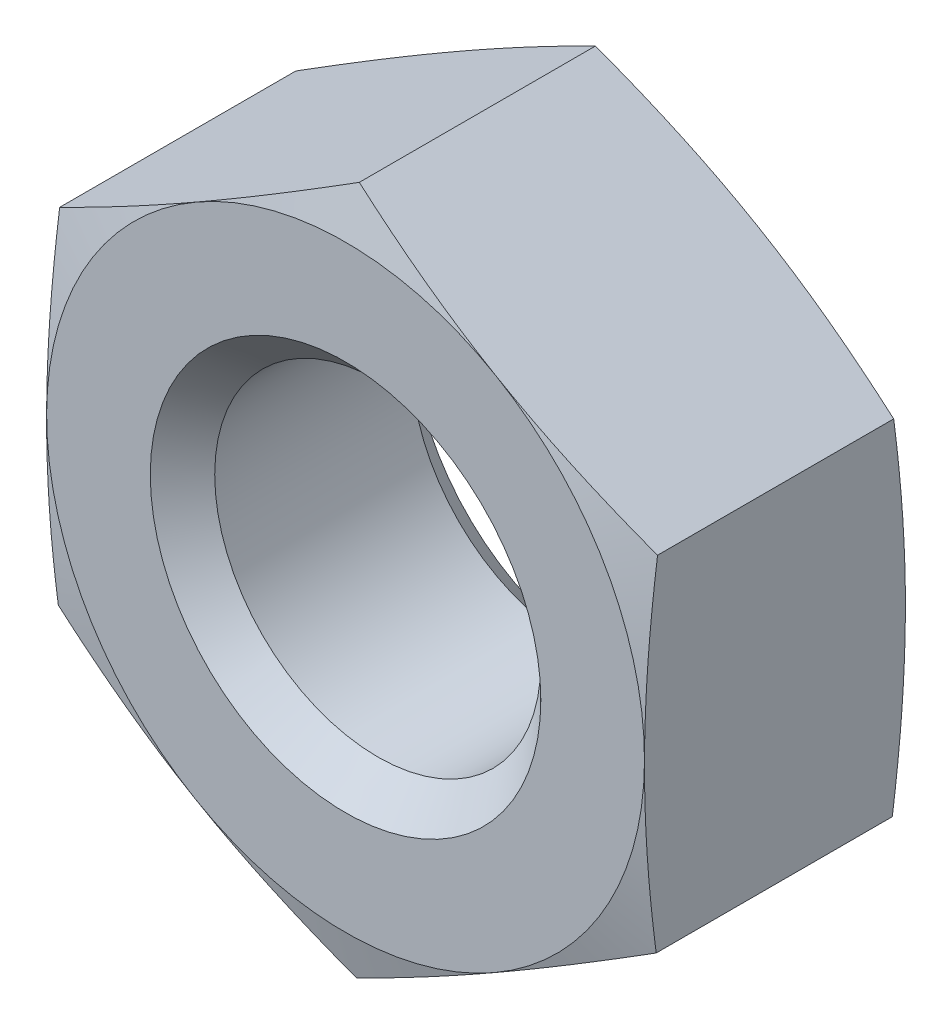
ISO-10303-21;
HEADER;
FILE_DESCRIPTION(('STEP AP214'),'2;1');
FILE_NAME('part.step','',(''),(''),'','','');
FILE_SCHEMA(('AUTOMOTIVE_DESIGN { 1 0 10303 214 1 1 1 1 }'));
ENDSEC;
DATA;
#1=APPLICATION_CONTEXT('core data for automotive mechanical design processes');
#2=APPLICATION_PROTOCOL_DEFINITION('international standard','automotive_design',2000,#1);
#3=PRODUCT_CONTEXT('',#1,'mechanical');
#4=PRODUCT('Part','Part','',(#3));
#5=PRODUCT_RELATED_PRODUCT_CATEGORY('part','',(#4));
#6=PRODUCT_DEFINITION_FORMATION('','',#4);
#7=PRODUCT_DEFINITION_CONTEXT('part definition',#1,'design');
#8=PRODUCT_DEFINITION('design','',#6,#7);
#9=PRODUCT_DEFINITION_SHAPE('','',#8);
#10=(LENGTH_UNIT() NAMED_UNIT(*) SI_UNIT(.MILLI.,.METRE.));
#11=(NAMED_UNIT(*) PLANE_ANGLE_UNIT() SI_UNIT($,.RADIAN.));
#12=(NAMED_UNIT(*) SI_UNIT($,.STERADIAN.) SOLID_ANGLE_UNIT());
#13=UNCERTAINTY_MEASURE_WITH_UNIT(LENGTH_MEASURE(1.E-05),#10,'distance_accuracy_value','');
#14=(GEOMETRIC_REPRESENTATION_CONTEXT(3) GLOBAL_UNCERTAINTY_ASSIGNED_CONTEXT((#13)) GLOBAL_UNIT_ASSIGNED_CONTEXT((#10,
#11,#12)) REPRESENTATION_CONTEXT('',''));
#15=CARTESIAN_POINT('',(0.,0.,0.));
#16=DIRECTION('',(0.,0.,1.));
#17=DIRECTION('',(1.,0.,0.));
#18=AXIS2_PLACEMENT_3D('',#15,#16,#17);
#19=CARTESIAN_POINT('',(2.75622420663921,1.57688346305915,2.4));
#20=DIRECTION('',(-0.503402758571263,-0.864051886557076,0.));
#21=DIRECTION('',(0.864051886557076,-0.503402758571263,0.));
#22=AXIS2_PLACEMENT_3D('',#19,#20,#21);
#23=PLANE('',#22);
#24=CARTESIAN_POINT('',(2.75642420663921,1.57676694164038,2.28597630562871));
#25=CARTESIAN_POINT('',(2.64246730397023,1.64315904152964,2.30365437862505));
#26=CARTESIAN_POINT('',(2.52830376483651,1.70967152928911,2.31970323754987));
#27=CARTESIAN_POINT('',(2.29957345240204,1.84293143189424,2.34789968129019));
#28=CARTESIAN_POINT('',(2.18500653432192,1.90967893108939,2.36004568099794));
#29=CARTESIAN_POINT('',(1.95616418569975,2.04300410677225,2.37972723842212));
#30=CARTESIAN_POINT('',(1.84189030306512,2.10958088143811,2.38728627052831));
#31=CARTESIAN_POINT('',(1.6131967873112,2.24281934603613,2.39742216920105));
#32=CARTESIAN_POINT('',(1.49877718669108,2.30948101703404,2.4));
#33=CARTESIAN_POINT('',(1.26993798545085,2.44280435902985,2.4));
#34=CARTESIAN_POINT('',(1.15551838483073,2.50946603002776,2.39742216920105));
#35=CARTESIAN_POINT('',(0.926824869076809,2.64270449462578,2.38728627052831));
#36=CARTESIAN_POINT('',(0.812550986442184,2.70928126929163,2.37972723842212));
#37=CARTESIAN_POINT('',(0.583708637820006,2.8426064449745,2.36004568099794));
#38=CARTESIAN_POINT('',(0.469141719739892,2.90935394416965,2.34789968129019));
#39=CARTESIAN_POINT('',(0.240411407305425,3.04261384677478,2.31970323754987));
#40=CARTESIAN_POINT('',(0.126247868171704,3.10912633453425,2.30365437862505));
#41=CARTESIAN_POINT('',(0.0122909655027258,3.17551843442351,2.28597630562871));
#42=B_SPLINE_CURVE_WITH_KNOTS('',3,(#24,#25,#26,#27,#28,#29,#30,#31,#32,#33,#34,#35,#36,#37,#38,
#39,#40,#41),.UNSPECIFIED.,.F.,.F.,(4,2,2,2,2,2,2,2,4),(0.,0.399219380024624,0.798600694727057,
1.19592049805513,1.59316338278475,1.99040626751437,2.38772607084244,2.78710738554488,
3.1863267655695),.UNSPECIFIED.);
#43=CARTESIAN_POINT('',(2.75622420663921,1.57688346305915,2.2860073180997));
#44=VERTEX_POINT('',#43);
#45=CARTESIAN_POINT('',(1.38435758607097,2.37614268803196,2.4));
#46=VERTEX_POINT('',#45);
#47=EDGE_CURVE('E74',#44,#46,#42,.T.);
#48=ORIENTED_EDGE('',*,*,#47,.F.);
#49=DIRECTION('',(0.,0.,-1.));
#50=VECTOR('',#49,1.);
#51=CARTESIAN_POINT('',(2.75622420663921,1.57688346305915,2.4));
#52=LINE('',#51,#50);
#53=CARTESIAN_POINT('',(2.75622420663921,1.57688346305915,0.113992681900295));
#54=VERTEX_POINT('',#53);
#55=EDGE_CURVE('E335',#44,#54,#52,.T.);
#56=ORIENTED_EDGE('',*,*,#55,.T.);
#57=CARTESIAN_POINT('',(0.0122909655027252,3.17551843442351,0.114023694371288));
#58=CARTESIAN_POINT('',(0.126247868171703,3.10912633453425,0.0963456213749529));
#59=CARTESIAN_POINT('',(0.240411407305425,3.04261384677478,0.0802967624501346));
#60=CARTESIAN_POINT('',(0.469141719739892,2.90935394416965,0.0521003187098057));
#61=CARTESIAN_POINT('',(0.583708637820006,2.8426064449745,0.0399543190020618));
#62=CARTESIAN_POINT('',(0.812550986442184,2.70928126929163,0.0202727615778808));
#63=CARTESIAN_POINT('',(0.926824869076809,2.64270449462578,0.0127137294716929));
#64=CARTESIAN_POINT('',(1.15551838483073,2.50946603002776,0.00257783079895237));
#65=CARTESIAN_POINT('',(1.26993798545085,2.44280435902985,0.));
#66=CARTESIAN_POINT('',(1.49877718669108,2.30948101703404,0.));
#67=CARTESIAN_POINT('',(1.6131967873112,2.24281934603613,0.00257783079895251));
#68=CARTESIAN_POINT('',(1.84189030306512,2.10958088143811,0.012713729471693));
#69=CARTESIAN_POINT('',(1.95616418569975,2.04300410677225,0.0202727615778809));
#70=CARTESIAN_POINT('',(2.18500653432192,1.90967893108939,0.0399543190020618));
#71=CARTESIAN_POINT('',(2.29957345240204,1.84293143189424,0.0521003187098058));
#72=CARTESIAN_POINT('',(2.52830376483651,1.70967152928911,0.0802967624501348));
#73=CARTESIAN_POINT('',(2.64246730397023,1.64315904152964,0.0963456213749532));
#74=CARTESIAN_POINT('',(2.75642420663921,1.57676694164038,0.114023694371289));
#75=B_SPLINE_CURVE_WITH_KNOTS('',3,(#57,#58,#59,#60,#61,#62,#63,#64,#65,#66,#67,#68,#69,#70,#71,
#72,#73,#74),.UNSPECIFIED.,.F.,.F.,(4,2,2,2,2,2,2,2,4),(0.,0.399219380024624,0.798600694727057,
1.19592049805513,1.59316338278475,1.99040626751437,2.38772607084244,2.78710738554488,
3.1863267655695),.UNSPECIFIED.);
#76=CARTESIAN_POINT('',(1.38435758607097,2.37614268803194,0.));
#77=VERTEX_POINT('',#76);
#78=EDGE_CURVE('E252',#77,#54,#75,.T.);
#79=ORIENTED_EDGE('',*,*,#78,.F.);
#80=CARTESIAN_POINT('',(0.0124909655027251,3.17540191300474,0.113992681900295));
#81=VERTEX_POINT('',#80);
#82=EDGE_CURVE('E261',#81,#77,#75,.T.);
#83=ORIENTED_EDGE('',*,*,#82,.F.);
#84=DIRECTION('',(0.,0.,-1.));
#85=VECTOR('',#84,1.);
#86=CARTESIAN_POINT('',(0.0124909655027252,3.17540191300474,2.4));
#87=LINE('',#86,#85);
#88=CARTESIAN_POINT('',(0.0124909655027252,3.17540191300474,2.2860073180997));
#89=VERTEX_POINT('',#88);
#90=EDGE_CURVE('E345',#89,#81,#87,.T.);
#91=ORIENTED_EDGE('',*,*,#90,.F.);
#92=EDGE_CURVE('E208',#46,#89,#42,.T.);
#93=ORIENTED_EDGE('',*,*,#92,.F.);
#94=EDGE_LOOP('',(#48,#56,#79,#83,#91,#93));
#95=FACE_BOUND('',#94,.T.);
#96=ADVANCED_FACE('F51',(#95),#23,.F.);
#97=CARTESIAN_POINT('',(0.0124909655027252,3.17540191300474,2.4));
#98=DIRECTION('',(0.496589504660666,-0.867985520536417,0.));
#99=DIRECTION('',(0.867985520536417,0.496589504660666,0.));
#100=AXIS2_PLACEMENT_3D('',#97,#98,#99);
#101=PLANE('',#100);
#102=CARTESIAN_POINT('',(0.0126909655027252,3.17551633645833,2.28597644618215));
#103=CARTESIAN_POINT('',(-0.101784655646926,3.1100228568352,2.30365449882257));
#104=CARTESIAN_POINT('',(-0.216467853699761,3.04441061888132,2.31970333863506));
#105=CARTESIAN_POINT('',(-0.446239319021437,2.91295439588035,2.34789974803124));
#106=CARTESIAN_POINT('',(-0.561327731728206,2.84711032762571,2.36004573251237));
#107=CARTESIAN_POINT('',(-0.791211743127703,2.71558971507018,2.37972726493454));
#108=CARTESIAN_POINT('',(-0.906005786870663,2.6499140603829,2.38728628721101));
#109=CARTESIAN_POINT('',(-1.13574028811269,2.51847898517019,2.39742217262927));
#110=CARTESIAN_POINT('',(-1.25068071296477,2.45271958332268,2.4));
#111=CARTESIAN_POINT('',(-1.48056156266891,2.32120077962765,2.4));
#112=CARTESIAN_POINT('',(-1.59550198752099,2.25544137778014,2.39742217262927));
#113=CARTESIAN_POINT('',(-1.82523648876302,2.12400630256743,2.38728628721101));
#114=CARTESIAN_POINT('',(-1.94003053250598,2.05833064788014,2.37972726493454));
#115=CARTESIAN_POINT('',(-2.16991454390547,1.92681003532461,2.36004573251237));
#116=CARTESIAN_POINT('',(-2.28500295661224,1.86096596706997,2.34789974803124));
#117=CARTESIAN_POINT('',(-2.51477442193392,1.72950974406901,2.31970333863506));
#118=CARTESIAN_POINT('',(-2.62945761998675,1.66389750611512,2.30365449882257));
#119=CARTESIAN_POINT('',(-2.74393324113641,1.59840402649199,2.28597644618215));
#120=B_SPLINE_CURVE_WITH_KNOTS('',3,(#102,#103,#104,#105,#106,#107,#108,#109,#110,#111,#112,
#113,#114,#115,#116,#117,#118,#119),.UNSPECIFIED.,.F.,.F.,(4,2,2,2,2,2,2,2,4),(0.,
0.399219113893778,0.798600161987334,1.19591970245069,1.59316232454533,1.99040494663998,
2.38772448710333,2.78710553519689,3.18632464909067),.UNSPECIFIED.);
#121=CARTESIAN_POINT('',(-1.36562113781683,2.38696018147515,2.4));
#122=VERTEX_POINT('',#121);
#123=EDGE_CURVE('E66',#89,#122,#120,.T.);
#124=ORIENTED_EDGE('',*,*,#123,.F.);
#125=ORIENTED_EDGE('',*,*,#90,.T.);
#126=CARTESIAN_POINT('',(-2.74393324113641,1.59840402649199,0.114023553817852));
#127=CARTESIAN_POINT('',(-2.62945761998676,1.66389750611512,0.0963455011774283));
#128=CARTESIAN_POINT('',(-2.51477442193392,1.72950974406901,0.0802966613649417));
#129=CARTESIAN_POINT('',(-2.28500295661224,1.86096596706997,0.0521002519687603));
#130=CARTESIAN_POINT('',(-2.16991454390547,1.92681003532461,0.0399542674876263));
#131=CARTESIAN_POINT('',(-1.94003053250598,2.05833064788014,0.0202727350654559));
#132=CARTESIAN_POINT('',(-1.82523648876302,2.12400630256743,0.0127137127889933));
#133=CARTESIAN_POINT('',(-1.59550198752099,2.25544137778014,0.00257782737072959));
#134=CARTESIAN_POINT('',(-1.48056156266891,2.32120077962765,0.));
#135=CARTESIAN_POINT('',(-1.25068071296477,2.45271958332268,0.));
#136=CARTESIAN_POINT('',(-1.1357402881127,2.51847898517019,0.00257782737072971));
#137=CARTESIAN_POINT('',(-0.906005786870663,2.6499140603829,0.0127137127889934));
#138=CARTESIAN_POINT('',(-0.791211743127704,2.71558971507018,0.0202727350654559));
#139=CARTESIAN_POINT('',(-0.561327731728206,2.84711032762571,0.0399542674876262));
#140=CARTESIAN_POINT('',(-0.446239319021438,2.91295439588035,0.0521002519687602));
#141=CARTESIAN_POINT('',(-0.216467853699761,3.04441061888132,0.0802966613649417));
#142=CARTESIAN_POINT('',(-0.101784655646926,3.1100228568352,0.0963455011774282));
#143=CARTESIAN_POINT('',(0.0126909655027246,3.17551633645833,0.114023553817852));
#144=B_SPLINE_CURVE_WITH_KNOTS('',3,(#126,#127,#128,#129,#130,#131,#132,#133,#134,#135,#136,
#137,#138,#139,#140,#141,#142,#143),.UNSPECIFIED.,.F.,.F.,(4,2,2,2,2,2,2,2,4),(0.,
0.399219113893778,0.798600161987333,1.19591970245069,1.59316232454533,1.99040494663998,
2.38772448710333,2.78710553519689,3.18632464909067),.UNSPECIFIED.);
#145=CARTESIAN_POINT('',(-1.36562113781684,2.38696018147516,0.));
#146=VERTEX_POINT('',#145);
#147=EDGE_CURVE('E380',#146,#81,#144,.T.);
#148=ORIENTED_EDGE('',*,*,#147,.F.);
#149=CARTESIAN_POINT('',(-2.74373324113641,1.59851844994559,0.113992681900295));
#150=VERTEX_POINT('',#149);
#151=EDGE_CURVE('E383',#150,#146,#144,.T.);
#152=ORIENTED_EDGE('',*,*,#151,.F.);
#153=DIRECTION('',(0.,0.,-1.));
#154=VECTOR('',#153,1.);
#155=CARTESIAN_POINT('',(-2.74373324113641,1.59851844994559,2.4));
#156=LINE('',#155,#154);
#157=CARTESIAN_POINT('',(-2.74373324113641,1.59851844994559,2.2860073180997));
#158=VERTEX_POINT('',#157);
#159=EDGE_CURVE('E343',#158,#150,#156,.T.);
#160=ORIENTED_EDGE('',*,*,#159,.F.);
#161=EDGE_CURVE('E147',#122,#158,#120,.T.);
#162=ORIENTED_EDGE('',*,*,#161,.F.);
#163=EDGE_LOOP('',(#124,#125,#148,#152,#160,#162));
#164=FACE_BOUND('',#163,.T.);
#165=ADVANCED_FACE('F270',(#164),#101,.F.);
#166=CARTESIAN_POINT('',(-2.74373324113641,1.59851844994559,2.4));
#167=DIRECTION('',(0.999992263231929,-0.00393363397934047,0.));
#168=DIRECTION('',(0.00393363397934047,0.99999226323193,0.));
#169=AXIS2_PLACEMENT_3D('',#166,#167,#168);
#170=PLANE('',#169);
#171=CARTESIAN_POINT('',(-2.74373245440352,1.59871844994559,2.28598052170744));
#172=CARTESIAN_POINT('',(-2.7442512379474,1.46683542958968,2.30365798410106));
#173=CARTESIAN_POINT('',(-2.74477096217433,1.33471327265422,2.31970626972659));
#174=CARTESIAN_POINT('',(-2.74581224627527,1.07000230812849,2.34790168327022));
#175=CARTESIAN_POINT('',(-2.74633380680831,0.937413333000125,2.36004722623671));
#176=CARTESIAN_POINT('',(-2.7473756009372,0.672572711264002,2.37972803369461));
#177=CARTESIAN_POINT('',(-2.74789582748676,0.540322855935874,2.38728677094625));
#178=CARTESIAN_POINT('',(-2.74893694408543,0.275654473147949,2.39742227203496));
#179=CARTESIAN_POINT('',(-2.74945783398661,0.143235983295568,2.4));
#180=CARTESIAN_POINT('',(-2.75049961378897,-0.121600996409194,2.4));
#181=CARTESIAN_POINT('',(-2.75102050369015,-0.254019486261576,2.39742227203496));
#182=CARTESIAN_POINT('',(-2.75206162028882,-0.5186878690495,2.38728677094625));
#183=CARTESIAN_POINT('',(-2.75258184683837,-0.650937724377628,2.37972803369461));
#184=CARTESIAN_POINT('',(-2.75362364096726,-0.915778346113751,2.36004722623671));
#185=CARTESIAN_POINT('',(-2.75414520150031,-1.04836732124212,2.34790168327023));
#186=CARTESIAN_POINT('',(-2.75518648560124,-1.31307828576785,2.31970626972659));
#187=CARTESIAN_POINT('',(-2.75570620982817,-1.4452004427033,2.30365798410106));
#188=CARTESIAN_POINT('',(-2.75622499337205,-1.57708346305921,2.28598052170744));
#189=B_SPLINE_CURVE_WITH_KNOTS('',3,(#171,#172,#173,#174,#175,#176,#177,#178,#179,#180,#181,
#182,#183,#184,#185,#186,#187,#188),.UNSPECIFIED.,.F.,.F.,(4,2,2,2,2,2,2,2,4),(0.,
0.39921139703684,0.798584714412668,1.19589663272394,1.59313163932816,1.99036664593238,
2.38767856424366,2.78705188161948,3.18626327865632),.UNSPECIFIED.);
#190=CARTESIAN_POINT('',(-2.74997872388781,0.0108174934431863,2.4));
#191=VERTEX_POINT('',#190);
#192=EDGE_CURVE('E140',#158,#191,#189,.T.);
#193=ORIENTED_EDGE('',*,*,#192,.F.);
#194=ORIENTED_EDGE('',*,*,#159,.T.);
#195=CARTESIAN_POINT('',(-2.75622499337205,-1.57708346305921,0.114019478292557));
#196=CARTESIAN_POINT('',(-2.75570620982817,-1.4452004427033,0.0963420158989422));
#197=CARTESIAN_POINT('',(-2.75518648560124,-1.31307828576785,0.0802937302734103));
#198=CARTESIAN_POINT('',(-2.75414520150031,-1.04836732124212,0.0520983167297749));
#199=CARTESIAN_POINT('',(-2.75362364096726,-0.915778346113751,0.039952773763288));
#200=CARTESIAN_POINT('',(-2.75258184683837,-0.650937724377628,0.0202719663053935));
#201=CARTESIAN_POINT('',(-2.75206162028882,-0.5186878690495,0.0127132290537472));
#202=CARTESIAN_POINT('',(-2.75102050369015,-0.254019486261576,0.00257772796504256));
#203=CARTESIAN_POINT('',(-2.75049961378897,-0.121600996409194,0.));
#204=CARTESIAN_POINT('',(-2.74945783398661,0.143235983295568,0.));
#205=CARTESIAN_POINT('',(-2.74893694408543,0.275654473147949,0.00257772796504258));
#206=CARTESIAN_POINT('',(-2.74789582748676,0.540322855935874,0.0127132290537473));
#207=CARTESIAN_POINT('',(-2.7473756009372,0.672572711264002,0.0202719663053936));
#208=CARTESIAN_POINT('',(-2.74633380680831,0.937413333000124,0.0399527737632882));
#209=CARTESIAN_POINT('',(-2.74581224627527,1.07000230812849,0.0520983167297751));
#210=CARTESIAN_POINT('',(-2.74477096217433,1.33471327265422,0.0802937302734104));
#211=CARTESIAN_POINT('',(-2.7442512379474,1.46683542958968,0.0963420158989423));
#212=CARTESIAN_POINT('',(-2.74373245440352,1.59871844994559,0.114019478292557));
#213=B_SPLINE_CURVE_WITH_KNOTS('',3,(#195,#196,#197,#198,#199,#200,#201,#202,#203,#204,#205,
#206,#207,#208,#209,#210,#211,#212),.UNSPECIFIED.,.F.,.F.,(4,2,2,2,2,2,2,2,4),(0.,
0.39921139703684,0.798584714412668,1.19589663272394,1.59313163932816,1.99036664593238,
2.38767856424366,2.78705188161948,3.18626327865632),.UNSPECIFIED.);
#214=CARTESIAN_POINT('',(-2.74997872388779,0.010817493443186,0.));
#215=VERTEX_POINT('',#214);
#216=EDGE_CURVE('E385',#215,#150,#213,.T.);
#217=ORIENTED_EDGE('',*,*,#216,.F.);
#218=CARTESIAN_POINT('',(-2.75622420663917,-1.57688346305921,0.113992681900294));
#219=VERTEX_POINT('',#218);
#220=EDGE_CURVE('E338',#219,#215,#213,.T.);
#221=ORIENTED_EDGE('',*,*,#220,.F.);
#222=DIRECTION('',(0.,0.,-1.));
#223=VECTOR('',#222,1.);
#224=CARTESIAN_POINT('',(-2.75622420663917,-1.57688346305921,2.4));
#225=LINE('',#224,#223);
#226=CARTESIAN_POINT('',(-2.75622420663917,-1.57688346305921,2.28600731809971));
#227=VERTEX_POINT('',#226);
#228=EDGE_CURVE('E174',#227,#219,#225,.T.);
#229=ORIENTED_EDGE('',*,*,#228,.F.);
#230=EDGE_CURVE('E151',#191,#227,#189,.T.);
#231=ORIENTED_EDGE('',*,*,#230,.F.);
#232=EDGE_LOOP('',(#193,#194,#217,#221,#229,#231));
#233=FACE_BOUND('',#232,.T.);
#234=ADVANCED_FACE('F172',(#233),#170,.F.);
#235=CARTESIAN_POINT('',(-2.75622420663917,-1.57688346305921,2.4));
#236=DIRECTION('',(0.503402758571253,0.864051886557082,0.));
#237=DIRECTION('',(-0.864051886557082,0.503402758571253,0.));
#238=AXIS2_PLACEMENT_3D('',#235,#236,#237);
#239=PLANE('',#238);
#240=CARTESIAN_POINT('',(-2.75642420663917,-1.57676694164044,2.28597630562871));
#241=CARTESIAN_POINT('',(-2.64246730397019,-1.6431590415297,2.30365437862505));
#242=CARTESIAN_POINT('',(-2.52830376483647,-1.70967152928917,2.31970323754986));
#243=CARTESIAN_POINT('',(-2.29957345240201,-1.84293143189429,2.34789968129019));
#244=CARTESIAN_POINT('',(-2.18500653432189,-1.90967893108944,2.36004568099794));
#245=CARTESIAN_POINT('',(-1.95616418569972,-2.0430041067723,2.37972723842212));
#246=CARTESIAN_POINT('',(-1.8418903030651,-2.10958088143815,2.3872862705283));
#247=CARTESIAN_POINT('',(-1.61319678731117,-2.24281934603617,2.39742216920104));
#248=CARTESIAN_POINT('',(-1.49877718669106,-2.30948101703407,2.4));
#249=CARTESIAN_POINT('',(-1.26993798545083,-2.44280435902988,2.4));
#250=CARTESIAN_POINT('',(-1.15551838483072,-2.50946603002778,2.39742216920104));
#251=CARTESIAN_POINT('',(-0.926824869076795,-2.6427044946258,2.3872862705283));
#252=CARTESIAN_POINT('',(-0.812550986442172,-2.70928126929165,2.37972723842211));
#253=CARTESIAN_POINT('',(-0.583708637819997,-2.84260644497451,2.36004568099793));
#254=CARTESIAN_POINT('',(-0.469141719739884,-2.90935394416966,2.34789968129019));
#255=CARTESIAN_POINT('',(-0.24041140730542,-3.04261384677479,2.31970323754986));
#256=CARTESIAN_POINT('',(-0.1262478681717,-3.10912633453425,2.30365437862505));
#257=CARTESIAN_POINT('',(-0.0122909655027241,-3.17551843442351,2.28597630562871));
#258=B_SPLINE_CURVE_WITH_KNOTS('',3,(#240,#241,#242,#243,#244,#245,#246,#247,#248,#249,#250,
#251,#252,#253,#254,#255,#256,#257),.UNSPECIFIED.,.F.,.F.,(4,2,2,2,2,2,2,2,4),(0.,
0.399219380024616,0.798600694727041,1.19592049805511,1.59316338278472,1.99040626751433,
2.3877260708424,2.78710738554482,3.18632676556944),.UNSPECIFIED.);
#259=CARTESIAN_POINT('',(-1.38435758607095,-2.37614268803198,2.4));
#260=VERTEX_POINT('',#259);
#261=EDGE_CURVE('E159',#227,#260,#258,.T.);
#262=ORIENTED_EDGE('',*,*,#261,.F.);
#263=ORIENTED_EDGE('',*,*,#228,.T.);
#264=CARTESIAN_POINT('',(-0.012290965502724,-3.17551843442351,0.114023694371289));
#265=CARTESIAN_POINT('',(-0.1262478681717,-3.10912633453425,0.0963456213749538));
#266=CARTESIAN_POINT('',(-0.24041140730542,-3.04261384677479,0.080296762450136));
#267=CARTESIAN_POINT('',(-0.469141719739884,-2.90935394416966,0.0521003187098083));
#268=CARTESIAN_POINT('',(-0.583708637819997,-2.84260644497451,0.0399543190020648));
#269=CARTESIAN_POINT('',(-0.812550986442172,-2.70928126929165,0.0202727615778847));
#270=CARTESIAN_POINT('',(-0.926824869076795,-2.6427044946258,0.0127137294716972));
#271=CARTESIAN_POINT('',(-1.15551838483072,-2.50946603002778,0.00257783079895714));
#272=CARTESIAN_POINT('',(-1.26993798545083,-2.44280435902988,0.));
#273=CARTESIAN_POINT('',(-1.49877718669106,-2.30948101703407,0.));
#274=CARTESIAN_POINT('',(-1.61319678731117,-2.24281934603617,0.00257783079895701));
#275=CARTESIAN_POINT('',(-1.8418903030651,-2.10958088143815,0.012713729471697));
#276=CARTESIAN_POINT('',(-1.95616418569972,-2.0430041067723,0.0202727615778844));
#277=CARTESIAN_POINT('',(-2.18500653432189,-1.90967893108944,0.0399543190020645));
#278=CARTESIAN_POINT('',(-2.29957345240201,-1.84293143189429,0.052100318709808));
#279=CARTESIAN_POINT('',(-2.52830376483647,-1.70967152928917,0.0802967624501358));
#280=CARTESIAN_POINT('',(-2.64246730397019,-1.6431590415297,0.0963456213749536));
#281=CARTESIAN_POINT('',(-2.75642420663917,-1.57676694164044,0.114023694371288));
#282=B_SPLINE_CURVE_WITH_KNOTS('',3,(#264,#265,#266,#267,#268,#269,#270,#271,#272,#273,#274,
#275,#276,#277,#278,#279,#280,#281),.UNSPECIFIED.,.F.,.F.,(4,2,2,2,2,2,2,2,4),(0.,
0.399219380024616,0.798600694727041,1.19592049805511,1.59316338278472,1.99040626751433,
2.3877260708424,2.78710738554482,3.18632676556944),.UNSPECIFIED.);
#283=CARTESIAN_POINT('',(-1.38435758607095,-2.37614268803198,0.));
#284=VERTEX_POINT('',#283);
#285=EDGE_CURVE('E381',#284,#219,#282,.T.);
#286=ORIENTED_EDGE('',*,*,#285,.F.);
#287=CARTESIAN_POINT('',(-0.0124909655027241,-3.17540191300474,0.113992681900295));
#288=VERTEX_POINT('',#287);
#289=EDGE_CURVE('E262',#288,#284,#282,.T.);
#290=ORIENTED_EDGE('',*,*,#289,.F.);
#291=DIRECTION('',(0.,0.,-1.));
#292=VECTOR('',#291,1.);
#293=CARTESIAN_POINT('',(-0.0124909655027241,-3.17540191300474,2.4));
#294=LINE('',#293,#292);
#295=CARTESIAN_POINT('',(-0.0124909655027241,-3.17540191300474,2.2860073180997));
#296=VERTEX_POINT('',#295);
#297=EDGE_CURVE('E334',#296,#288,#294,.T.);
#298=ORIENTED_EDGE('',*,*,#297,.F.);
#299=EDGE_CURVE('E175',#260,#296,#258,.T.);
#300=ORIENTED_EDGE('',*,*,#299,.F.);
#301=EDGE_LOOP('',(#262,#263,#286,#290,#298,#300));
#302=FACE_BOUND('',#301,.T.);
#303=ADVANCED_FACE('F238',(#302),#239,.F.);
#304=CARTESIAN_POINT('',(-0.0124909655027241,-3.17540191300474,2.4));
#305=DIRECTION('',(-0.496589504660676,0.867985520536411,0.));
#306=DIRECTION('',(-0.867985520536411,-0.496589504660676,0.));
#307=AXIS2_PLACEMENT_3D('',#304,#305,#306);
#308=PLANE('',#307);
#309=CARTESIAN_POINT('',(-0.0126909655027241,-3.17551633645833,2.28597644618215));
#310=CARTESIAN_POINT('',(0.101784655646929,-3.1100228568352,2.30365449882257));
#311=CARTESIAN_POINT('',(0.216467853699765,-3.04441061888131,2.31970333863506));
#312=CARTESIAN_POINT('',(0.446239319021445,-2.91295439588034,2.34789974803124));
#313=CARTESIAN_POINT('',(0.561327731728215,-2.8471103276257,2.36004573251238));
#314=CARTESIAN_POINT('',(0.791211743127715,-2.71558971507016,2.37972726493455));
#315=CARTESIAN_POINT('',(0.906005786870676,-2.64991406038288,2.38728628721101));
#316=CARTESIAN_POINT('',(1.13574028811271,-2.51847898517016,2.39742217262927));
#317=CARTESIAN_POINT('',(1.25068071296479,-2.45271958332265,2.4));
#318=CARTESIAN_POINT('',(1.48056156266893,-2.32120077962761,2.4));
#319=CARTESIAN_POINT('',(1.59550198752101,-2.2554413777801,2.39742217262927));
#320=CARTESIAN_POINT('',(1.82523648876304,-2.12400630256738,2.38728628721101));
#321=CARTESIAN_POINT('',(1.940030532506,-2.0583306478801,2.37972726493455));
#322=CARTESIAN_POINT('',(2.1699145439055,-1.92681003532456,2.36004573251238));
#323=CARTESIAN_POINT('',(2.28500295661227,-1.86096596706992,2.34789974803124));
#324=CARTESIAN_POINT('',(2.51477442193395,-1.72950974406895,2.31970333863506));
#325=CARTESIAN_POINT('',(2.62945761998679,-1.66389750611506,2.30365449882257));
#326=CARTESIAN_POINT('',(2.74393324113644,-1.59840402649193,2.28597644618215));
#327=B_SPLINE_CURVE_WITH_KNOTS('',3,(#309,#310,#311,#312,#313,#314,#315,#316,#317,#318,#319,
#320,#321,#322,#323,#324,#325,#326),.UNSPECIFIED.,.F.,.F.,(4,2,2,2,2,2,2,2,4),(0.,
0.399219113893786,0.79860016198735,1.19591970245071,1.59316232454537,1.99040494664002,
2.38772448710338,2.78710553519694,3.18632464909073),.UNSPECIFIED.);
#328=CARTESIAN_POINT('',(1.36562113781686,-2.38696018147513,2.4));
#329=VERTEX_POINT('',#328);
#330=EDGE_CURVE('E232',#296,#329,#327,.T.);
#331=ORIENTED_EDGE('',*,*,#330,.F.);
#332=ORIENTED_EDGE('',*,*,#297,.T.);
#333=CARTESIAN_POINT('',(2.74393324113644,-1.59840402649193,0.114023553817852));
#334=CARTESIAN_POINT('',(2.62945761998679,-1.66389750611506,0.0963455011774278));
#335=CARTESIAN_POINT('',(2.51477442193395,-1.72950974406895,0.0802966613649405));
#336=CARTESIAN_POINT('',(2.28500295661227,-1.86096596706992,0.0521002519687578));
#337=CARTESIAN_POINT('',(2.1699145439055,-1.92681003532456,0.0399542674876232));
#338=CARTESIAN_POINT('',(1.940030532506,-2.0583306478801,0.0202727350654519));
#339=CARTESIAN_POINT('',(1.82523648876304,-2.12400630256738,0.0127137127889891));
#340=CARTESIAN_POINT('',(1.59550198752101,-2.2554413777801,0.00257782737072502));
#341=CARTESIAN_POINT('',(1.48056156266893,-2.32120077962761,0.));
#342=CARTESIAN_POINT('',(1.25068071296479,-2.45271958332265,0.));
#343=CARTESIAN_POINT('',(1.13574028811271,-2.51847898517016,0.00257782737072495));
#344=CARTESIAN_POINT('',(0.906005786870676,-2.64991406038288,0.012713712788989));
#345=CARTESIAN_POINT('',(0.791211743127715,-2.71558971507016,0.0202727350654519));
#346=CARTESIAN_POINT('',(0.561327731728215,-2.8471103276257,0.0399542674876231));
#347=CARTESIAN_POINT('',(0.446239319021445,-2.91295439588034,0.0521002519687577));
#348=CARTESIAN_POINT('',(0.216467853699765,-3.04441061888131,0.0802966613649404));
#349=CARTESIAN_POINT('',(0.101784655646929,-3.1100228568352,0.0963455011774277));
#350=CARTESIAN_POINT('',(-0.0126909655027241,-3.17551633645833,0.114023553817852));
#351=B_SPLINE_CURVE_WITH_KNOTS('',3,(#333,#334,#335,#336,#337,#338,#339,#340,#341,#342,#343,
#344,#345,#346,#347,#348,#349,#350),.UNSPECIFIED.,.F.,.F.,(4,2,2,2,2,2,2,2,4),(0.,
0.399219113893786,0.79860016198735,1.19591970245071,1.59316232454537,1.99040494664002,
2.38772448710338,2.78710553519694,3.18632464909073),.UNSPECIFIED.);
#352=CARTESIAN_POINT('',(1.36562113781686,-2.38696018147513,0.));
#353=VERTEX_POINT('',#352);
#354=EDGE_CURVE('E254',#353,#288,#351,.T.);
#355=ORIENTED_EDGE('',*,*,#354,.F.);
#356=CARTESIAN_POINT('',(2.74373324113644,-1.59851844994552,0.113992681900295));
#357=VERTEX_POINT('',#356);
#358=EDGE_CURVE('E245',#357,#353,#351,.T.);
#359=ORIENTED_EDGE('',*,*,#358,.F.);
#360=DIRECTION('',(0.,0.,-1.));
#361=VECTOR('',#360,1.);
#362=CARTESIAN_POINT('',(2.74373324113644,-1.59851844994552,2.4));
#363=LINE('',#362,#361);
#364=CARTESIAN_POINT('',(2.74373324113644,-1.59851844994552,2.2860073180997));
#365=VERTEX_POINT('',#364);
#366=EDGE_CURVE('E325',#365,#357,#363,.T.);
#367=ORIENTED_EDGE('',*,*,#366,.F.);
#368=EDGE_CURVE('E226',#329,#365,#327,.T.);
#369=ORIENTED_EDGE('',*,*,#368,.F.);
#370=EDGE_LOOP('',(#331,#332,#355,#359,#367,#369));
#371=FACE_BOUND('',#370,.T.);
#372=ADVANCED_FACE('F234',(#371),#308,.F.);
#373=CARTESIAN_POINT('',(2.74373324113644,-1.59851844994552,2.4));
#374=DIRECTION('',(-0.999992263231929,0.00393363397934077,0.));
#375=DIRECTION('',(-0.00393363397934077,-0.99999226323193,0.));
#376=AXIS2_PLACEMENT_3D('',#373,#374,#375);
#377=PLANE('',#376);
#378=CARTESIAN_POINT('',(2.74373245440356,-1.59871844994552,2.28598052170744));
#379=CARTESIAN_POINT('',(2.74425123794744,-1.46683542958962,2.30365798410106));
#380=CARTESIAN_POINT('',(2.74477096217437,-1.33471327265417,2.31970626972659));
#381=CARTESIAN_POINT('',(2.74581224627531,-1.07000230812845,2.34790168327022));
#382=CARTESIAN_POINT('',(2.74633380680835,-0.937413333000087,2.36004722623671));
#383=CARTESIAN_POINT('',(2.74737560093724,-0.672572711263975,2.3797280336946));
#384=CARTESIAN_POINT('',(2.74789582748679,-0.540322855935853,2.38728677094624));
#385=CARTESIAN_POINT('',(2.74893694408546,-0.275654473147939,2.39742227203495));
#386=CARTESIAN_POINT('',(2.74945783398664,-0.143235983295563,2.39999999999999));
#387=CARTESIAN_POINT('',(2.75049961378901,0.121600996409189,2.39999999999999));
#388=CARTESIAN_POINT('',(2.75102050369019,0.254019486261565,2.39742227203495));
#389=CARTESIAN_POINT('',(2.75206162028886,0.518687869049478,2.38728677094624));
#390=CARTESIAN_POINT('',(2.75258184683841,0.650937724377601,2.3797280336946));
#391=CARTESIAN_POINT('',(2.7536236409673,0.915778346113713,2.36004722623671));
#392=CARTESIAN_POINT('',(2.75414520150034,1.04836732124207,2.34790168327022));
#393=CARTESIAN_POINT('',(2.75518648560128,1.31307828576779,2.31970626972659));
#394=CARTESIAN_POINT('',(2.75570620982821,1.44520044270324,2.30365798410106));
#395=CARTESIAN_POINT('',(2.75622499337209,1.57708346305915,2.28598052170744));
#396=B_SPLINE_CURVE_WITH_KNOTS('',3,(#378,#379,#380,#381,#382,#383,#384,#385,#386,#387,#388,
#389,#390,#391,#392,#393,#394,#395),.UNSPECIFIED.,.F.,.F.,(4,2,2,2,2,2,2,2,4),(0.,
0.399211397036823,0.798584714412635,1.1958966327239,1.5931316393281,1.9903666459323,
2.38767856424356,2.78705188161937,3.18626327865619),.UNSPECIFIED.);
#397=CARTESIAN_POINT('',(2.74997872388782,-0.0108174934431872,2.4));
#398=VERTEX_POINT('',#397);
#399=EDGE_CURVE('E233',#365,#398,#396,.T.);
#400=ORIENTED_EDGE('',*,*,#399,.F.);
#401=ORIENTED_EDGE('',*,*,#366,.T.);
#402=CARTESIAN_POINT('',(2.75622499337209,1.57708346305915,0.114019478292557));
#403=CARTESIAN_POINT('',(2.75570620982821,1.44520044270324,0.0963420158989439));
#404=CARTESIAN_POINT('',(2.75518648560128,1.31307828576779,0.0802937302734133));
#405=CARTESIAN_POINT('',(2.75414520150034,1.04836732124207,0.0520983167297804));
#406=CARTESIAN_POINT('',(2.7536236409673,0.915778346113714,0.0399527737632946));
#407=CARTESIAN_POINT('',(2.75258184683841,0.650937724377601,0.0202719663054019));
#408=CARTESIAN_POINT('',(2.75206162028886,0.518687869049479,0.0127132290537562));
#409=CARTESIAN_POINT('',(2.75102050369019,0.254019486261565,0.00257772796505248));
#410=CARTESIAN_POINT('',(2.75049961378901,0.121600996409189,0.));
#411=CARTESIAN_POINT('',(2.74945783398664,-0.143235983295562,0.));
#412=CARTESIAN_POINT('',(2.74893694408546,-0.275654473147938,0.00257772796505243));
#413=CARTESIAN_POINT('',(2.74789582748679,-0.540322855935852,0.0127132290537561));
#414=CARTESIAN_POINT('',(2.74737560093724,-0.672572711263974,0.0202719663054018));
#415=CARTESIAN_POINT('',(2.74633380680835,-0.937413333000086,0.0399527737632945));
#416=CARTESIAN_POINT('',(2.74581224627531,-1.07000230812845,0.0520983167297804));
#417=CARTESIAN_POINT('',(2.74477096217437,-1.33471327265417,0.0802937302734133));
#418=CARTESIAN_POINT('',(2.74425123794744,-1.46683542958962,0.0963420158989438));
#419=CARTESIAN_POINT('',(2.74373245440356,-1.59871844994552,0.114019478292557));
#420=B_SPLINE_CURVE_WITH_KNOTS('',3,(#402,#403,#404,#405,#406,#407,#408,#409,#410,#411,#412,
#413,#414,#415,#416,#417,#418,#419),.UNSPECIFIED.,.F.,.F.,(4,2,2,2,2,2,2,2,4),(0.,
0.399211397036824,0.798584714412635,1.1958966327239,1.5931316393281,1.9903666459323,
2.38767856424356,2.78705188161937,3.18626327865619),.UNSPECIFIED.);
#421=CARTESIAN_POINT('',(2.74997872388783,-0.0108174934431872,0.));
#422=VERTEX_POINT('',#421);
#423=EDGE_CURVE('E346',#422,#357,#420,.T.);
#424=ORIENTED_EDGE('',*,*,#423,.F.);
#425=EDGE_CURVE('E164',#54,#422,#420,.T.);
#426=ORIENTED_EDGE('',*,*,#425,.F.);
#427=ORIENTED_EDGE('',*,*,#55,.F.);
#428=EDGE_CURVE('E218',#398,#44,#396,.T.);
#429=ORIENTED_EDGE('',*,*,#428,.F.);
#430=EDGE_LOOP('',(#400,#401,#424,#426,#427,#429));
#431=FACE_BOUND('',#430,.T.);
#432=ADVANCED_FACE('F237',(#431),#377,.F.);
#433=CARTESIAN_POINT('',(5.49995744777554,-0.0216349868863517,2.4));
#434=DIRECTION('',(0.,0.,-1.));
#435=DIRECTION('',(-1.,0.,0.));
#436=AXIS2_PLACEMENT_3D('',#433,#434,#435);
#437=PLANE('',#436);
#438=CARTESIAN_POINT('',(0.,0.,2.4));
#439=DIRECTION('',(0.,0.,-1.));
#440=DIRECTION('',(-1.,0.,0.));
#441=AXIS2_PLACEMENT_3D('',#438,#439,#440);
#442=CIRCLE('',#441,1.7964285714285);
#443=CARTESIAN_POINT('',(-1.7964285714285,0.,2.4));
#444=VERTEX_POINT('',#443);
#445=EDGE_CURVE('E12',#444,#444,#442,.T.);
#446=ORIENTED_EDGE('',*,*,#445,.T.);
#447=EDGE_LOOP('',(#446));
#448=FACE_BOUND('',#447,.T.);
#449=CARTESIAN_POINT('',(0.,0.,2.4));
#450=DIRECTION('',(0.,0.,-1.));
#451=DIRECTION('',(-1.,0.,0.));
#452=AXIS2_PLACEMENT_3D('',#449,#450,#451);
#453=CIRCLE('',#452,2.75);
#454=EDGE_CURVE('E144',#191,#122,#453,.T.);
#455=ORIENTED_EDGE('',*,*,#454,.F.);
#456=EDGE_CURVE('E156',#260,#191,#453,.T.);
#457=ORIENTED_EDGE('',*,*,#456,.F.);
#458=EDGE_CURVE('E163',#329,#260,#453,.T.);
#459=ORIENTED_EDGE('',*,*,#458,.F.);
#460=EDGE_CURVE('E543',#398,#329,#453,.T.);
#461=ORIENTED_EDGE('',*,*,#460,.F.);
#462=EDGE_CURVE('E170',#46,#398,#453,.T.);
#463=ORIENTED_EDGE('',*,*,#462,.F.);
#464=CARTESIAN_POINT('',(0.,0.,2.4));
#465=DIRECTION('',(0.,0.,1.));
#466=DIRECTION('',(1.,0.,0.));
#467=AXIS2_PLACEMENT_3D('',#464,#465,#466);
#468=CIRCLE('',#467,2.75);
#469=EDGE_CURVE('E168',#46,#122,#468,.T.);
#470=ORIENTED_EDGE('',*,*,#469,.T.);
#471=EDGE_LOOP('',(#455,#457,#459,#461,#463,#470));
#472=FACE_BOUND('',#471,.T.);
#473=ADVANCED_FACE('F166',(#448,#472),#437,.F.);
#474=CARTESIAN_POINT('',(5.49995744777554,-0.0216349868863517,0.));
#475=DIRECTION('',(0.,0.,-1.));
#476=DIRECTION('',(-1.,0.,0.));
#477=AXIS2_PLACEMENT_3D('',#474,#475,#476);
#478=PLANE('',#477);
#479=CARTESIAN_POINT('',(0.,0.,0.));
#480=DIRECTION('',(0.,0.,-1.));
#481=DIRECTION('',(-1.,0.,0.));
#482=AXIS2_PLACEMENT_3D('',#479,#480,#481);
#483=CIRCLE('',#482,1.7964285714285);
#484=CARTESIAN_POINT('',(-1.7964285714285,0.,0.));
#485=VERTEX_POINT('',#484);
#486=EDGE_CURVE('E169',#485,#485,#483,.F.);
#487=ORIENTED_EDGE('',*,*,#486,.T.);
#488=EDGE_LOOP('',(#487));
#489=FACE_BOUND('',#488,.T.);
#490=CARTESIAN_POINT('',(0.,0.,0.));
#491=DIRECTION('',(0.,0.,-1.));
#492=DIRECTION('',(-1.,0.,0.));
#493=AXIS2_PLACEMENT_3D('',#490,#491,#492);
#494=CIRCLE('',#493,2.75);
#495=EDGE_CURVE('E367',#284,#215,#494,.T.);
#496=ORIENTED_EDGE('',*,*,#495,.T.);
#497=EDGE_CURVE('E253',#215,#146,#494,.T.);
#498=ORIENTED_EDGE('',*,*,#497,.T.);
#499=EDGE_CURVE('E366',#146,#77,#494,.T.);
#500=ORIENTED_EDGE('',*,*,#499,.T.);
#501=EDGE_CURVE('E355',#77,#422,#494,.T.);
#502=ORIENTED_EDGE('',*,*,#501,.T.);
#503=EDGE_CURVE('E359',#422,#353,#494,.T.);
#504=ORIENTED_EDGE('',*,*,#503,.T.);
#505=EDGE_CURVE('E362',#353,#284,#494,.T.);
#506=ORIENTED_EDGE('',*,*,#505,.T.);
#507=EDGE_LOOP('',(#496,#498,#500,#502,#504,#506));
#508=FACE_BOUND('',#507,.T.);
#509=ADVANCED_FACE('F299',(#489,#508),#478,.T.);
#510=CARTESIAN_POINT('',(0.,0.,2.4));
#511=DIRECTION('',(0.,0.,-1.));
#512=DIRECTION('',(-1.,0.,0.));
#513=AXIS2_PLACEMENT_3D('',#510,#511,#512);
#514=CYLINDRICAL_SURFACE('',#513,1.5);
#515=CARTESIAN_POINT('',(0.,0.,0.296428571428501));
#516=DIRECTION('',(0.,0.,-1.));
#517=DIRECTION('',(-1.,0.,0.));
#518=AXIS2_PLACEMENT_3D('',#515,#516,#517);
#519=CIRCLE('',#518,1.5);
#520=CARTESIAN_POINT('',(-1.5,0.,0.296428571428501));
#521=VERTEX_POINT('',#520);
#522=EDGE_CURVE('E59',#521,#521,#519,.T.);
#523=ORIENTED_EDGE('',*,*,#522,.T.);
#524=EDGE_LOOP('',(#523));
#525=FACE_BOUND('',#524,.T.);
#526=CARTESIAN_POINT('',(0.,0.,2.1035714285715));
#527=DIRECTION('',(0.,0.,-1.));
#528=DIRECTION('',(-1.,0.,0.));
#529=AXIS2_PLACEMENT_3D('',#526,#527,#528);
#530=CIRCLE('',#529,1.5);
#531=CARTESIAN_POINT('',(-1.5,0.,2.1035714285715));
#532=VERTEX_POINT('',#531);
#533=EDGE_CURVE('E289',#532,#532,#530,.F.);
#534=ORIENTED_EDGE('',*,*,#533,.T.);
#535=EDGE_LOOP('',(#534));
#536=FACE_BOUND('',#535,.T.);
#537=ADVANCED_FACE('F295',(#525,#536),#514,.F.);
#538=CARTESIAN_POINT('',(0.,0.,0.));
#539=DIRECTION('',(0.,0.,1.));
#540=DIRECTION('',(-1.,0.,0.));
#541=AXIS2_PLACEMENT_3D('',#538,#539,#540);
#542=CONICAL_SURFACE('',#541,2.75,1.30899693899575);
#543=ORIENTED_EDGE('',*,*,#358,.T.);
#544=ORIENTED_EDGE('',*,*,#503,.F.);
#545=ORIENTED_EDGE('',*,*,#423,.T.);
#546=EDGE_LOOP('',(#543,#544,#545));
#547=FACE_BOUND('',#546,.T.);
#548=ADVANCED_FACE('F298',(#547),#542,.T.);
#549=ORIENTED_EDGE('',*,*,#78,.T.);
#550=ORIENTED_EDGE('',*,*,#425,.T.);
#551=ORIENTED_EDGE('',*,*,#501,.F.);
#552=EDGE_LOOP('',(#549,#550,#551));
#553=FACE_BOUND('',#552,.T.);
#554=ADVANCED_FACE('F305',(#553),#542,.T.);
#555=ORIENTED_EDGE('',*,*,#289,.T.);
#556=ORIENTED_EDGE('',*,*,#505,.F.);
#557=ORIENTED_EDGE('',*,*,#354,.T.);
#558=EDGE_LOOP('',(#555,#556,#557));
#559=FACE_BOUND('',#558,.T.);
#560=ADVANCED_FACE('F403',(#559),#542,.T.);
#561=ORIENTED_EDGE('',*,*,#220,.T.);
#562=ORIENTED_EDGE('',*,*,#495,.F.);
#563=ORIENTED_EDGE('',*,*,#285,.T.);
#564=EDGE_LOOP('',(#561,#562,#563));
#565=FACE_BOUND('',#564,.T.);
#566=ADVANCED_FACE('F203',(#565),#542,.T.);
#567=ORIENTED_EDGE('',*,*,#216,.T.);
#568=ORIENTED_EDGE('',*,*,#151,.T.);
#569=ORIENTED_EDGE('',*,*,#497,.F.);
#570=EDGE_LOOP('',(#567,#568,#569));
#571=FACE_BOUND('',#570,.T.);
#572=ADVANCED_FACE('F400',(#571),#542,.T.);
#573=ORIENTED_EDGE('',*,*,#147,.T.);
#574=ORIENTED_EDGE('',*,*,#82,.T.);
#575=ORIENTED_EDGE('',*,*,#499,.F.);
#576=EDGE_LOOP('',(#573,#574,#575));
#577=FACE_BOUND('',#576,.T.);
#578=ADVANCED_FACE('F401',(#577),#542,.T.);
#579=CARTESIAN_POINT('',(0.,0.,2.4));
#580=DIRECTION('',(0.,0.,-1.));
#581=DIRECTION('',(1.,0.,0.));
#582=AXIS2_PLACEMENT_3D('',#579,#580,#581);
#583=CONICAL_SURFACE('',#582,2.75,1.30899693899575);
#584=ORIENTED_EDGE('',*,*,#230,.T.);
#585=ORIENTED_EDGE('',*,*,#261,.T.);
#586=ORIENTED_EDGE('',*,*,#456,.T.);
#587=EDGE_LOOP('',(#584,#585,#586));
#588=FACE_BOUND('',#587,.T.);
#589=ADVANCED_FACE('F157',(#588),#583,.T.);
#590=ORIENTED_EDGE('',*,*,#299,.T.);
#591=ORIENTED_EDGE('',*,*,#330,.T.);
#592=ORIENTED_EDGE('',*,*,#458,.T.);
#593=EDGE_LOOP('',(#590,#591,#592));
#594=FACE_BOUND('',#593,.T.);
#595=ADVANCED_FACE('F407',(#594),#583,.T.);
#596=ORIENTED_EDGE('',*,*,#368,.T.);
#597=ORIENTED_EDGE('',*,*,#399,.T.);
#598=ORIENTED_EDGE('',*,*,#460,.T.);
#599=EDGE_LOOP('',(#596,#597,#598));
#600=FACE_BOUND('',#599,.T.);
#601=ADVANCED_FACE('F202',(#600),#583,.T.);
#602=ORIENTED_EDGE('',*,*,#47,.T.);
#603=ORIENTED_EDGE('',*,*,#462,.T.);
#604=ORIENTED_EDGE('',*,*,#428,.T.);
#605=EDGE_LOOP('',(#602,#603,#604));
#606=FACE_BOUND('',#605,.T.);
#607=ADVANCED_FACE('F197',(#606),#583,.T.);
#608=ORIENTED_EDGE('',*,*,#92,.T.);
#609=ORIENTED_EDGE('',*,*,#123,.T.);
#610=ORIENTED_EDGE('',*,*,#469,.F.);
#611=EDGE_LOOP('',(#608,#609,#610));
#612=FACE_BOUND('',#611,.T.);
#613=ADVANCED_FACE('F201',(#612),#583,.T.);
#614=ORIENTED_EDGE('',*,*,#161,.T.);
#615=ORIENTED_EDGE('',*,*,#192,.T.);
#616=ORIENTED_EDGE('',*,*,#454,.T.);
#617=EDGE_LOOP('',(#614,#615,#616));
#618=FACE_BOUND('',#617,.T.);
#619=ADVANCED_FACE('F142',(#618),#583,.T.);
#620=CARTESIAN_POINT('',(0.,0.,0.));
#621=DIRECTION('',(0.,0.,-1.));
#622=DIRECTION('',(-1.,0.,0.));
#623=AXIS2_PLACEMENT_3D('',#620,#621,#622);
#624=CONICAL_SURFACE('',#623,1.7964285714285,0.785398163397446);
#625=ORIENTED_EDGE('',*,*,#522,.F.);
#626=EDGE_LOOP('',(#625));
#627=FACE_BOUND('',#626,.T.);
#628=ORIENTED_EDGE('',*,*,#486,.F.);
#629=EDGE_LOOP('',(#628));
#630=FACE_BOUND('',#629,.T.);
#631=ADVANCED_FACE('F273',(#627,#630),#624,.F.);
#632=CARTESIAN_POINT('',(0.,0.,2.1035714285715));
#633=DIRECTION('',(0.,0.,1.));
#634=DIRECTION('',(1.,0.,0.));
#635=AXIS2_PLACEMENT_3D('',#632,#633,#634);
#636=CONICAL_SURFACE('',#635,1.5,0.785398163397449);
#637=ORIENTED_EDGE('',*,*,#445,.F.);
#638=EDGE_LOOP('',(#637));
#639=FACE_BOUND('',#638,.T.);
#640=ORIENTED_EDGE('',*,*,#533,.F.);
#641=EDGE_LOOP('',(#640));
#642=FACE_BOUND('',#641,.T.);
#643=ADVANCED_FACE('F53',(#639,#642),#636,.F.);
#644=CLOSED_SHELL('',(#96,#165,#234,#303,#372,#432,#473,#509,#537,#548,#554,#560,#566,#572,#578,
#589,#595,#601,#607,#613,#619,#631,#643));
#645=MANIFOLD_SOLID_BREP('B2',#644);
#646=ADVANCED_BREP_SHAPE_REPRESENTATION('',(#18,#645),#14);
#647=SHAPE_DEFINITION_REPRESENTATION(#9,#646);
ENDSEC;
END-ISO-10303-21;
